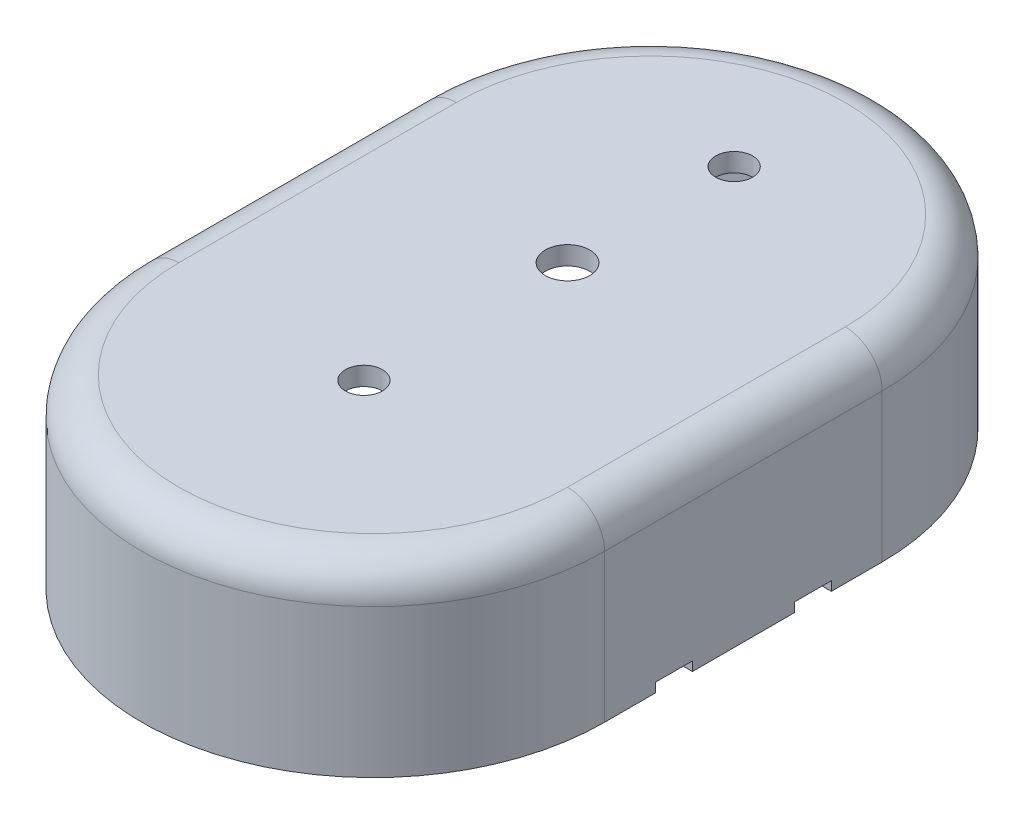
ISO-10303-21;
HEADER;
FILE_DESCRIPTION(('STEP AP214'),'2;1');
FILE_NAME('part.step','',(''),(''),'','','');
FILE_SCHEMA(('AUTOMOTIVE_DESIGN { 1 0 10303 214 1 1 1 1 }'));
ENDSEC;
DATA;
#1=APPLICATION_CONTEXT('core data for automotive mechanical design processes');
#2=APPLICATION_PROTOCOL_DEFINITION('international standard','automotive_design',2000,#1);
#3=PRODUCT_CONTEXT('',#1,'mechanical');
#4=PRODUCT('Part','Part','',(#3));
#5=PRODUCT_RELATED_PRODUCT_CATEGORY('part','',(#4));
#6=PRODUCT_DEFINITION_FORMATION('','',#4);
#7=PRODUCT_DEFINITION_CONTEXT('part definition',#1,'design');
#8=PRODUCT_DEFINITION('design','',#6,#7);
#9=PRODUCT_DEFINITION_SHAPE('','',#8);
#10=(LENGTH_UNIT() NAMED_UNIT(*) SI_UNIT(.MILLI.,.METRE.));
#11=(NAMED_UNIT(*) PLANE_ANGLE_UNIT() SI_UNIT($,.RADIAN.));
#12=(NAMED_UNIT(*) SI_UNIT($,.STERADIAN.) SOLID_ANGLE_UNIT());
#13=UNCERTAINTY_MEASURE_WITH_UNIT(LENGTH_MEASURE(1.E-05),#10,'distance_accuracy_value','');
#14=(GEOMETRIC_REPRESENTATION_CONTEXT(3) GLOBAL_UNCERTAINTY_ASSIGNED_CONTEXT((#13)) GLOBAL_UNIT_ASSIGNED_CONTEXT((#10,
#11,#12)) REPRESENTATION_CONTEXT('',''));
#15=CARTESIAN_POINT('',(0.,0.,0.));
#16=DIRECTION('',(0.,0.,1.));
#17=DIRECTION('',(1.,0.,0.));
#18=AXIS2_PLACEMENT_3D('',#15,#16,#17);
#19=CARTESIAN_POINT('',(0.,0.,-37.5));
#20=DIRECTION('',(0.,1.,0.));
#21=DIRECTION('',(0.,0.,1.));
#22=AXIS2_PLACEMENT_3D('',#19,#20,#21);
#23=PLANE('',#22);
#24=DIRECTION('',(0.,0.,1.));
#25=VECTOR('',#24,1.);
#26=CARTESIAN_POINT('',(60.,0.,37.5));
#27=LINE('',#26,#25);
#28=CARTESIAN_POINT('',(60.,0.,-13.75));
#29=VERTEX_POINT('',#28);
#30=CARTESIAN_POINT('',(60.,0.,13.75));
#31=VERTEX_POINT('',#30);
#32=EDGE_CURVE('E372',#29,#31,#27,.T.);
#33=ORIENTED_EDGE('',*,*,#32,.F.);
#34=DIRECTION('',(-1.,0.,0.));
#35=VECTOR('',#34,1.);
#36=CARTESIAN_POINT('',(62.5,0.,-13.75));
#37=LINE('',#36,#35);
#38=CARTESIAN_POINT('',(62.5,0.,-13.75));
#39=VERTEX_POINT('',#38);
#40=EDGE_CURVE('E284',#39,#29,#37,.T.);
#41=ORIENTED_EDGE('',*,*,#40,.F.);
#42=DIRECTION('',(0.,0.,-1.));
#43=VECTOR('',#42,1.);
#44=CARTESIAN_POINT('',(62.5,0.,37.5));
#45=LINE('',#44,#43);
#46=CARTESIAN_POINT('',(62.5,0.,13.75));
#47=VERTEX_POINT('',#46);
#48=EDGE_CURVE('E268',#47,#39,#45,.T.);
#49=ORIENTED_EDGE('',*,*,#48,.F.);
#50=DIRECTION('',(-1.,0.,0.));
#51=VECTOR('',#50,1.);
#52=CARTESIAN_POINT('',(62.5,0.,13.75));
#53=LINE('',#52,#51);
#54=EDGE_CURVE('E281',#47,#31,#53,.T.);
#55=ORIENTED_EDGE('',*,*,#54,.T.);
#56=EDGE_LOOP('',(#33,#41,#49,#55));
#57=FACE_BOUND('',#56,.T.);
#58=ADVANCED_FACE('F37',(#57),#23,.F.);
#59=DIRECTION('',(0.,0.,1.));
#60=VECTOR('',#59,1.);
#61=CARTESIAN_POINT('',(-62.5,0.,37.5));
#62=LINE('',#61,#60);
#63=CARTESIAN_POINT('',(-62.5,0.,-13.75));
#64=VERTEX_POINT('',#63);
#65=CARTESIAN_POINT('',(-62.5,0.,13.75));
#66=VERTEX_POINT('',#65);
#67=EDGE_CURVE('E441',#64,#66,#62,.T.);
#68=ORIENTED_EDGE('',*,*,#67,.F.);
#69=CARTESIAN_POINT('',(-60.,0.,-13.75));
#70=VERTEX_POINT('',#69);
#71=EDGE_CURVE('E287',#70,#64,#37,.T.);
#72=ORIENTED_EDGE('',*,*,#71,.F.);
#73=DIRECTION('',(0.,0.,-1.));
#74=VECTOR('',#73,1.);
#75=CARTESIAN_POINT('',(-60.,0.,37.5));
#76=LINE('',#75,#74);
#77=CARTESIAN_POINT('',(-60.,0.,13.75));
#78=VERTEX_POINT('',#77);
#79=EDGE_CURVE('E366',#78,#70,#76,.T.);
#80=ORIENTED_EDGE('',*,*,#79,.F.);
#81=EDGE_CURVE('E313',#78,#66,#53,.T.);
#82=ORIENTED_EDGE('',*,*,#81,.T.);
#83=EDGE_LOOP('',(#68,#72,#80,#82));
#84=FACE_BOUND('',#83,.T.);
#85=ADVANCED_FACE('F524',(#84),#23,.F.);
#86=CARTESIAN_POINT('',(62.5,0.,-23.75));
#87=VERTEX_POINT('',#86);
#88=CARTESIAN_POINT('',(62.5,0.,-37.5));
#89=VERTEX_POINT('',#88);
#90=EDGE_CURVE('E444',#87,#89,#45,.T.);
#91=ORIENTED_EDGE('',*,*,#90,.F.);
#92=DIRECTION('',(-1.,0.,0.));
#93=VECTOR('',#92,1.);
#94=CARTESIAN_POINT('',(62.5,0.,-23.75));
#95=LINE('',#94,#93);
#96=CARTESIAN_POINT('',(60.,0.,-23.75));
#97=VERTEX_POINT('',#96);
#98=EDGE_CURVE('E288',#87,#97,#95,.T.);
#99=ORIENTED_EDGE('',*,*,#98,.T.);
#100=CARTESIAN_POINT('',(60.,0.,-37.5));
#101=VERTEX_POINT('',#100);
#102=EDGE_CURVE('E347',#101,#97,#27,.T.);
#103=ORIENTED_EDGE('',*,*,#102,.F.);
#104=CARTESIAN_POINT('',(0.,0.,-37.5));
#105=DIRECTION('',(0.,-1.,0.));
#106=DIRECTION('',(0.,0.,-1.));
#107=AXIS2_PLACEMENT_3D('',#104,#105,#106);
#108=CIRCLE('',#107,60.);
#109=CARTESIAN_POINT('',(-60.,0.,-37.5));
#110=VERTEX_POINT('',#109);
#111=EDGE_CURVE('E365',#110,#101,#108,.T.);
#112=ORIENTED_EDGE('',*,*,#111,.F.);
#113=CARTESIAN_POINT('',(-60.,0.,-23.75));
#114=VERTEX_POINT('',#113);
#115=EDGE_CURVE('E361',#114,#110,#76,.T.);
#116=ORIENTED_EDGE('',*,*,#115,.F.);
#117=CARTESIAN_POINT('',(-62.5,0.,-23.75));
#118=VERTEX_POINT('',#117);
#119=EDGE_CURVE('E291',#114,#118,#95,.T.);
#120=ORIENTED_EDGE('',*,*,#119,.T.);
#121=CARTESIAN_POINT('',(-62.5,0.,-37.5));
#122=VERTEX_POINT('',#121);
#123=EDGE_CURVE('E437',#122,#118,#62,.T.);
#124=ORIENTED_EDGE('',*,*,#123,.F.);
#125=CARTESIAN_POINT('',(0.,0.,-37.5));
#126=DIRECTION('',(0.,1.,0.));
#127=DIRECTION('',(0.,0.,1.));
#128=AXIS2_PLACEMENT_3D('',#125,#126,#127);
#129=CIRCLE('',#128,62.5);
#130=EDGE_CURVE('E432',#89,#122,#129,.T.);
#131=ORIENTED_EDGE('',*,*,#130,.F.);
#132=EDGE_LOOP('',(#91,#99,#103,#112,#116,#120,#124,#131));
#133=FACE_BOUND('',#132,.T.);
#134=ADVANCED_FACE('F504',(#133),#23,.F.);
#135=CARTESIAN_POINT('',(60.,2.5,37.5));
#136=DIRECTION('',(1.,0.,0.));
#137=DIRECTION('',(0.,0.,-1.));
#138=AXIS2_PLACEMENT_3D('',#135,#136,#137);
#139=PLANE('',#138);
#140=DIRECTION('',(0.,0.,1.));
#141=VECTOR('',#140,1.);
#142=CARTESIAN_POINT('',(60.,2.5,37.5));
#143=LINE('',#142,#141);
#144=CARTESIAN_POINT('',(60.,2.5,-13.75));
#145=VERTEX_POINT('',#144);
#146=CARTESIAN_POINT('',(60.,2.5,13.75));
#147=VERTEX_POINT('',#146);
#148=EDGE_CURVE('E359',#145,#147,#143,.T.);
#149=ORIENTED_EDGE('',*,*,#148,.F.);
#150=DIRECTION('',(0.,-1.,0.));
#151=VECTOR('',#150,1.);
#152=CARTESIAN_POINT('',(60.,2.5,-13.75));
#153=LINE('',#152,#151);
#154=EDGE_CURVE('E249',#145,#29,#153,.T.);
#155=ORIENTED_EDGE('',*,*,#154,.T.);
#156=ORIENTED_EDGE('',*,*,#32,.T.);
#157=DIRECTION('',(0.,1.,0.));
#158=VECTOR('',#157,1.);
#159=CARTESIAN_POINT('',(60.,2.5,13.75));
#160=LINE('',#159,#158);
#161=EDGE_CURVE('E329',#31,#147,#160,.T.);
#162=ORIENTED_EDGE('',*,*,#161,.T.);
#163=EDGE_LOOP('',(#149,#155,#156,#162));
#164=FACE_BOUND('',#163,.T.);
#165=ADVANCED_FACE('F608',(#164),#139,.F.);
#166=ORIENTED_EDGE('',*,*,#102,.T.);
#167=DIRECTION('',(0.,1.,0.));
#168=VECTOR('',#167,1.);
#169=CARTESIAN_POINT('',(60.,2.5,-23.75));
#170=LINE('',#169,#168);
#171=CARTESIAN_POINT('',(60.,2.5,-23.75));
#172=VERTEX_POINT('',#171);
#173=EDGE_CURVE('E335',#97,#172,#170,.T.);
#174=ORIENTED_EDGE('',*,*,#173,.T.);
#175=CARTESIAN_POINT('',(60.,2.5,-37.5));
#176=VERTEX_POINT('',#175);
#177=EDGE_CURVE('E356',#176,#172,#143,.T.);
#178=ORIENTED_EDGE('',*,*,#177,.F.);
#179=DIRECTION('',(0.,-1.,0.));
#180=VECTOR('',#179,1.);
#181=CARTESIAN_POINT('',(60.,2.5,-37.5));
#182=LINE('',#181,#180);
#183=EDGE_CURVE('E377',#176,#101,#182,.T.);
#184=ORIENTED_EDGE('',*,*,#183,.T.);
#185=EDGE_LOOP('',(#166,#174,#178,#184));
#186=FACE_BOUND('',#185,.T.);
#187=ADVANCED_FACE('F609',(#186),#139,.F.);
#188=CARTESIAN_POINT('',(-60.,2.5,37.5));
#189=DIRECTION('',(-1.,0.,0.));
#190=DIRECTION('',(0.,0.,1.));
#191=AXIS2_PLACEMENT_3D('',#188,#189,#190);
#192=PLANE('',#191);
#193=ORIENTED_EDGE('',*,*,#79,.T.);
#194=DIRECTION('',(0.,1.,0.));
#195=VECTOR('',#194,1.);
#196=CARTESIAN_POINT('',(-60.,2.5,-13.75));
#197=LINE('',#196,#195);
#198=CARTESIAN_POINT('',(-60.,2.5,-13.75));
#199=VERTEX_POINT('',#198);
#200=EDGE_CURVE('E338',#70,#199,#197,.T.);
#201=ORIENTED_EDGE('',*,*,#200,.T.);
#202=DIRECTION('',(0.,0.,-1.));
#203=VECTOR('',#202,1.);
#204=CARTESIAN_POINT('',(-60.,2.5,37.5));
#205=LINE('',#204,#203);
#206=CARTESIAN_POINT('',(-60.,2.5,13.75));
#207=VERTEX_POINT('',#206);
#208=EDGE_CURVE('E352',#207,#199,#205,.T.);
#209=ORIENTED_EDGE('',*,*,#208,.F.);
#210=DIRECTION('',(0.,-1.,0.));
#211=VECTOR('',#210,1.);
#212=CARTESIAN_POINT('',(-60.,2.5,13.75));
#213=LINE('',#212,#211);
#214=EDGE_CURVE('E326',#207,#78,#213,.T.);
#215=ORIENTED_EDGE('',*,*,#214,.T.);
#216=EDGE_LOOP('',(#193,#201,#209,#215));
#217=FACE_BOUND('',#216,.T.);
#218=ADVANCED_FACE('F624',(#217),#192,.F.);
#219=CARTESIAN_POINT('',(-60.,2.5,-23.75));
#220=VERTEX_POINT('',#219);
#221=CARTESIAN_POINT('',(-60.,2.5,-37.5));
#222=VERTEX_POINT('',#221);
#223=EDGE_CURVE('E346',#220,#222,#205,.T.);
#224=ORIENTED_EDGE('',*,*,#223,.F.);
#225=DIRECTION('',(0.,-1.,0.));
#226=VECTOR('',#225,1.);
#227=CARTESIAN_POINT('',(-60.,2.5,-23.75));
#228=LINE('',#227,#226);
#229=EDGE_CURVE('E332',#220,#114,#228,.T.);
#230=ORIENTED_EDGE('',*,*,#229,.T.);
#231=ORIENTED_EDGE('',*,*,#115,.T.);
#232=DIRECTION('',(0.,-1.,0.));
#233=VECTOR('',#232,1.);
#234=CARTESIAN_POINT('',(-60.,2.5,-37.5));
#235=LINE('',#234,#233);
#236=EDGE_CURVE('E379',#222,#110,#235,.T.);
#237=ORIENTED_EDGE('',*,*,#236,.F.);
#238=EDGE_LOOP('',(#224,#230,#231,#237));
#239=FACE_BOUND('',#238,.T.);
#240=ADVANCED_FACE('F574',(#239),#192,.F.);
#241=CARTESIAN_POINT('',(0.,50.,-37.5));
#242=DIRECTION('',(0.,-1.,0.));
#243=DIRECTION('',(0.,0.,-1.));
#244=AXIS2_PLACEMENT_3D('',#241,#242,#243);
#245=CYLINDRICAL_SURFACE('',#244,62.5);
#246=DIRECTION('',(0.,-1.,0.));
#247=VECTOR('',#246,1.);
#248=CARTESIAN_POINT('',(-62.5,50.,-37.5));
#249=LINE('',#248,#247);
#250=CARTESIAN_POINT('',(-62.5,40.,-37.5));
#251=VERTEX_POINT('',#250);
#252=EDGE_CURVE('E456',#251,#122,#249,.T.);
#253=ORIENTED_EDGE('',*,*,#252,.F.);
#254=CARTESIAN_POINT('',(0.,40.,-37.5));
#255=DIRECTION('',(0.,1.,0.));
#256=DIRECTION('',(0.,0.,1.));
#257=AXIS2_PLACEMENT_3D('',#254,#255,#256);
#258=CIRCLE('',#257,62.5);
#259=CARTESIAN_POINT('',(62.5,40.,-37.5));
#260=VERTEX_POINT('',#259);
#261=EDGE_CURVE('E45',#251,#260,#258,.F.);
#262=ORIENTED_EDGE('',*,*,#261,.T.);
#263=DIRECTION('',(0.,-1.,0.));
#264=VECTOR('',#263,1.);
#265=CARTESIAN_POINT('',(62.5,50.,-37.5));
#266=LINE('',#265,#264);
#267=EDGE_CURVE('E448',#260,#89,#266,.T.);
#268=ORIENTED_EDGE('',*,*,#267,.T.);
#269=ORIENTED_EDGE('',*,*,#130,.T.);
#270=EDGE_LOOP('',(#253,#262,#268,#269));
#271=FACE_BOUND('',#270,.T.);
#272=ADVANCED_FACE('F499',(#271),#245,.T.);
#273=CARTESIAN_POINT('',(-62.5,50.,37.5));
#274=DIRECTION('',(1.,0.,0.));
#275=DIRECTION('',(0.,0.,-1.));
#276=AXIS2_PLACEMENT_3D('',#273,#274,#275);
#277=PLANE('',#276);
#278=DIRECTION('',(0.,0.,-1.));
#279=VECTOR('',#278,1.);
#280=CARTESIAN_POINT('',(-62.5,2.5,-23.75));
#281=LINE('',#280,#279);
#282=CARTESIAN_POINT('',(-62.5,2.5,-13.75));
#283=VERTEX_POINT('',#282);
#284=CARTESIAN_POINT('',(-62.5,2.5,-23.75));
#285=VERTEX_POINT('',#284);
#286=EDGE_CURVE('E271',#283,#285,#281,.T.);
#287=ORIENTED_EDGE('',*,*,#286,.F.);
#288=DIRECTION('',(0.,1.,0.));
#289=VECTOR('',#288,1.);
#290=CARTESIAN_POINT('',(-62.5,0.,-13.75));
#291=LINE('',#290,#289);
#292=EDGE_CURVE('E278',#64,#283,#291,.T.);
#293=ORIENTED_EDGE('',*,*,#292,.F.);
#294=ORIENTED_EDGE('',*,*,#67,.T.);
#295=DIRECTION('',(0.,-1.,0.));
#296=VECTOR('',#295,1.);
#297=CARTESIAN_POINT('',(-62.5,0.,13.75));
#298=LINE('',#297,#296);
#299=CARTESIAN_POINT('',(-62.5,2.5,13.75));
#300=VERTEX_POINT('',#299);
#301=EDGE_CURVE('E297',#300,#66,#298,.T.);
#302=ORIENTED_EDGE('',*,*,#301,.F.);
#303=DIRECTION('',(0.,0.,-1.));
#304=VECTOR('',#303,1.);
#305=CARTESIAN_POINT('',(-62.5,2.5,23.75));
#306=LINE('',#305,#304);
#307=CARTESIAN_POINT('',(-62.5,2.5,23.75));
#308=VERTEX_POINT('',#307);
#309=EDGE_CURVE('E306',#308,#300,#306,.T.);
#310=ORIENTED_EDGE('',*,*,#309,.F.);
#311=DIRECTION('',(0.,1.,0.));
#312=VECTOR('',#311,1.);
#313=CARTESIAN_POINT('',(-62.5,0.,23.75));
#314=LINE('',#313,#312);
#315=CARTESIAN_POINT('',(-62.5,0.,23.75));
#316=VERTEX_POINT('',#315);
#317=EDGE_CURVE('E303',#316,#308,#314,.T.);
#318=ORIENTED_EDGE('',*,*,#317,.F.);
#319=CARTESIAN_POINT('',(-62.5,0.,37.5));
#320=VERTEX_POINT('',#319);
#321=EDGE_CURVE('E435',#316,#320,#62,.T.);
#322=ORIENTED_EDGE('',*,*,#321,.T.);
#323=DIRECTION('',(0.,-1.,0.));
#324=VECTOR('',#323,1.);
#325=CARTESIAN_POINT('',(-62.5,50.,37.5));
#326=LINE('',#325,#324);
#327=CARTESIAN_POINT('',(-62.5,40.,37.5));
#328=VERTEX_POINT('',#327);
#329=EDGE_CURVE('E453',#328,#320,#326,.T.);
#330=ORIENTED_EDGE('',*,*,#329,.F.);
#331=DIRECTION('',(0.,0.,1.));
#332=VECTOR('',#331,1.);
#333=CARTESIAN_POINT('',(-62.5,40.,-37.5));
#334=LINE('',#333,#332);
#335=EDGE_CURVE('E472',#328,#251,#334,.F.);
#336=ORIENTED_EDGE('',*,*,#335,.T.);
#337=ORIENTED_EDGE('',*,*,#252,.T.);
#338=ORIENTED_EDGE('',*,*,#123,.T.);
#339=DIRECTION('',(0.,-1.,0.));
#340=VECTOR('',#339,1.);
#341=CARTESIAN_POINT('',(-62.5,0.,-23.75));
#342=LINE('',#341,#340);
#343=EDGE_CURVE('E269',#285,#118,#342,.T.);
#344=ORIENTED_EDGE('',*,*,#343,.F.);
#345=EDGE_LOOP('',(#287,#293,#294,#302,#310,#318,#322,#330,#336,#337,#338,#344));
#346=FACE_BOUND('',#345,.T.);
#347=ADVANCED_FACE('F496',(#346),#277,.F.);
#348=CARTESIAN_POINT('',(0.,50.,37.5));
#349=DIRECTION('',(0.,-1.,0.));
#350=DIRECTION('',(0.,0.,-1.));
#351=AXIS2_PLACEMENT_3D('',#348,#349,#350);
#352=CYLINDRICAL_SURFACE('',#351,62.5);
#353=DIRECTION('',(0.,-1.,0.));
#354=VECTOR('',#353,1.);
#355=CARTESIAN_POINT('',(62.5,50.,37.5));
#356=LINE('',#355,#354);
#357=CARTESIAN_POINT('',(62.5,40.,37.5));
#358=VERTEX_POINT('',#357);
#359=CARTESIAN_POINT('',(62.5,0.,37.5));
#360=VERTEX_POINT('',#359);
#361=EDGE_CURVE('E451',#358,#360,#356,.T.);
#362=ORIENTED_EDGE('',*,*,#361,.F.);
#363=CARTESIAN_POINT('',(0.,40.,37.5));
#364=DIRECTION('',(0.,1.,0.));
#365=DIRECTION('',(0.,0.,1.));
#366=AXIS2_PLACEMENT_3D('',#363,#364,#365);
#367=CIRCLE('',#366,62.5);
#368=EDGE_CURVE('E470',#358,#328,#367,.F.);
#369=ORIENTED_EDGE('',*,*,#368,.T.);
#370=ORIENTED_EDGE('',*,*,#329,.T.);
#371=CARTESIAN_POINT('',(0.,0.,37.5));
#372=DIRECTION('',(0.,1.,0.));
#373=DIRECTION('',(0.,0.,-1.));
#374=AXIS2_PLACEMENT_3D('',#371,#372,#373);
#375=CIRCLE('',#374,62.5);
#376=EDGE_CURVE('E440',#320,#360,#375,.T.);
#377=ORIENTED_EDGE('',*,*,#376,.T.);
#378=EDGE_LOOP('',(#362,#369,#370,#377));
#379=FACE_BOUND('',#378,.T.);
#380=ADVANCED_FACE('F535',(#379),#352,.T.);
#381=CARTESIAN_POINT('',(62.5,50.,37.5));
#382=DIRECTION('',(-1.,0.,0.));
#383=DIRECTION('',(0.,0.,1.));
#384=AXIS2_PLACEMENT_3D('',#381,#382,#383);
#385=PLANE('',#384);
#386=ORIENTED_EDGE('',*,*,#48,.T.);
#387=DIRECTION('',(0.,1.,0.));
#388=VECTOR('',#387,1.);
#389=CARTESIAN_POINT('',(62.5,0.,-13.75));
#390=LINE('',#389,#388);
#391=CARTESIAN_POINT('',(62.5,2.5,-13.75));
#392=VERTEX_POINT('',#391);
#393=EDGE_CURVE('E246',#39,#392,#390,.T.);
#394=ORIENTED_EDGE('',*,*,#393,.T.);
#395=DIRECTION('',(0.,0.,-1.));
#396=VECTOR('',#395,1.);
#397=CARTESIAN_POINT('',(62.5,2.5,-23.75));
#398=LINE('',#397,#396);
#399=CARTESIAN_POINT('',(62.5,2.5,-23.75));
#400=VERTEX_POINT('',#399);
#401=EDGE_CURVE('E255',#392,#400,#398,.T.);
#402=ORIENTED_EDGE('',*,*,#401,.T.);
#403=DIRECTION('',(0.,-1.,0.));
#404=VECTOR('',#403,1.);
#405=CARTESIAN_POINT('',(62.5,0.,-23.75));
#406=LINE('',#405,#404);
#407=EDGE_CURVE('E262',#400,#87,#406,.T.);
#408=ORIENTED_EDGE('',*,*,#407,.T.);
#409=ORIENTED_EDGE('',*,*,#90,.T.);
#410=ORIENTED_EDGE('',*,*,#267,.F.);
#411=DIRECTION('',(0.,0.,-1.));
#412=VECTOR('',#411,1.);
#413=CARTESIAN_POINT('',(62.5,40.,37.5));
#414=LINE('',#413,#412);
#415=EDGE_CURVE('E467',#260,#358,#414,.F.);
#416=ORIENTED_EDGE('',*,*,#415,.T.);
#417=ORIENTED_EDGE('',*,*,#361,.T.);
#418=CARTESIAN_POINT('',(62.5,0.,23.75));
#419=VERTEX_POINT('',#418);
#420=EDGE_CURVE('E445',#360,#419,#45,.T.);
#421=ORIENTED_EDGE('',*,*,#420,.T.);
#422=DIRECTION('',(0.,1.,0.));
#423=VECTOR('',#422,1.);
#424=CARTESIAN_POINT('',(62.5,0.,23.75));
#425=LINE('',#424,#423);
#426=CARTESIAN_POINT('',(62.5,2.5,23.75));
#427=VERTEX_POINT('',#426);
#428=EDGE_CURVE('E293',#419,#427,#425,.T.);
#429=ORIENTED_EDGE('',*,*,#428,.T.);
#430=DIRECTION('',(0.,0.,-1.));
#431=VECTOR('',#430,1.);
#432=CARTESIAN_POINT('',(62.5,2.5,23.75));
#433=LINE('',#432,#431);
#434=CARTESIAN_POINT('',(62.5,2.5,13.75));
#435=VERTEX_POINT('',#434);
#436=EDGE_CURVE('E296',#427,#435,#433,.T.);
#437=ORIENTED_EDGE('',*,*,#436,.T.);
#438=DIRECTION('',(0.,-1.,0.));
#439=VECTOR('',#438,1.);
#440=CARTESIAN_POINT('',(62.5,0.,13.75));
#441=LINE('',#440,#439);
#442=EDGE_CURVE('E300',#435,#47,#441,.T.);
#443=ORIENTED_EDGE('',*,*,#442,.T.);
#444=EDGE_LOOP('',(#386,#394,#402,#408,#409,#410,#416,#417,#421,#429,#437,#443));
#445=FACE_BOUND('',#444,.T.);
#446=ADVANCED_FACE('F265',(#445),#385,.F.);
#447=CARTESIAN_POINT('',(0.,50.,-37.5));
#448=DIRECTION('',(0.,1.,0.));
#449=DIRECTION('',(0.,0.,1.));
#450=AXIS2_PLACEMENT_3D('',#447,#448,#449);
#451=PLANE('',#450);
#452=CARTESIAN_POINT('',(0.,50.,-60.));
#453=DIRECTION('',(0.,1.,0.));
#454=DIRECTION('',(0.,0.,1.));
#455=AXIS2_PLACEMENT_3D('',#452,#453,#454);
#456=CIRCLE('',#455,5.);
#457=CARTESIAN_POINT('',(0.,50.,-55.));
#458=VERTEX_POINT('',#457);
#459=EDGE_CURVE('E968',#458,#458,#456,.T.);
#460=ORIENTED_EDGE('',*,*,#459,.F.);
#461=EDGE_LOOP('',(#460));
#462=FACE_BOUND('',#461,.T.);
#463=CARTESIAN_POINT('',(0.,50.,-15.));
#464=DIRECTION('',(0.,1.,0.));
#465=DIRECTION('',(0.,0.,1.));
#466=AXIS2_PLACEMENT_3D('',#463,#464,#465);
#467=CIRCLE('',#466,6.);
#468=CARTESIAN_POINT('',(0.,50.,-8.99999999999997));
#469=VERTEX_POINT('',#468);
#470=EDGE_CURVE('E975',#469,#469,#467,.T.);
#471=ORIENTED_EDGE('',*,*,#470,.F.);
#472=EDGE_LOOP('',(#471));
#473=FACE_BOUND('',#472,.T.);
#474=CARTESIAN_POINT('',(0.,50.,40.));
#475=DIRECTION('',(0.,1.,0.));
#476=DIRECTION('',(0.,0.,1.));
#477=AXIS2_PLACEMENT_3D('',#474,#475,#476);
#478=CIRCLE('',#477,5.);
#479=CARTESIAN_POINT('',(0.,50.,45.));
#480=VERTEX_POINT('',#479);
#481=EDGE_CURVE('E979',#480,#480,#478,.T.);
#482=ORIENTED_EDGE('',*,*,#481,.F.);
#483=EDGE_LOOP('',(#482));
#484=FACE_BOUND('',#483,.T.);
#485=CARTESIAN_POINT('',(0.,50.,37.5));
#486=DIRECTION('',(0.,1.,0.));
#487=DIRECTION('',(0.,0.,1.));
#488=AXIS2_PLACEMENT_3D('',#485,#486,#487);
#489=CIRCLE('',#488,52.5);
#490=CARTESIAN_POINT('',(-52.5,50.,37.5));
#491=VERTEX_POINT('',#490);
#492=CARTESIAN_POINT('',(52.5,50.,37.5));
#493=VERTEX_POINT('',#492);
#494=EDGE_CURVE('E462',#491,#493,#489,.T.);
#495=ORIENTED_EDGE('',*,*,#494,.T.);
#496=DIRECTION('',(0.,0.,-1.));
#497=VECTOR('',#496,1.);
#498=CARTESIAN_POINT('',(52.5,50.,-37.5));
#499=LINE('',#498,#497);
#500=CARTESIAN_POINT('',(52.5,50.,-37.5));
#501=VERTEX_POINT('',#500);
#502=EDGE_CURVE('E464',#493,#501,#499,.T.);
#503=ORIENTED_EDGE('',*,*,#502,.T.);
#504=CARTESIAN_POINT('',(0.,50.,-37.5));
#505=DIRECTION('',(0.,1.,0.));
#506=DIRECTION('',(0.,0.,1.));
#507=AXIS2_PLACEMENT_3D('',#504,#505,#506);
#508=CIRCLE('',#507,52.5);
#509=CARTESIAN_POINT('',(-52.5,50.,-37.5));
#510=VERTEX_POINT('',#509);
#511=EDGE_CURVE('E458',#501,#510,#508,.T.);
#512=ORIENTED_EDGE('',*,*,#511,.T.);
#513=DIRECTION('',(0.,0.,1.));
#514=VECTOR('',#513,1.);
#515=CARTESIAN_POINT('',(-52.5,50.,37.5));
#516=LINE('',#515,#514);
#517=EDGE_CURVE('E460',#510,#491,#516,.T.);
#518=ORIENTED_EDGE('',*,*,#517,.T.);
#519=EDGE_LOOP('',(#495,#503,#512,#518));
#520=FACE_BOUND('',#519,.T.);
#521=ADVANCED_FACE('F548',(#462,#473,#484,#520),#451,.T.);
#522=ORIENTED_EDGE('',*,*,#321,.F.);
#523=DIRECTION('',(-1.,0.,0.));
#524=VECTOR('',#523,1.);
#525=CARTESIAN_POINT('',(62.5,0.,23.75));
#526=LINE('',#525,#524);
#527=CARTESIAN_POINT('',(-60.,0.,23.75));
#528=VERTEX_POINT('',#527);
#529=EDGE_CURVE('E302',#528,#316,#526,.T.);
#530=ORIENTED_EDGE('',*,*,#529,.F.);
#531=CARTESIAN_POINT('',(-60.,0.,37.5));
#532=VERTEX_POINT('',#531);
#533=EDGE_CURVE('E362',#532,#528,#76,.T.);
#534=ORIENTED_EDGE('',*,*,#533,.F.);
#535=CARTESIAN_POINT('',(0.,0.,37.5));
#536=DIRECTION('',(0.,-1.,0.));
#537=DIRECTION('',(0.,0.,-1.));
#538=AXIS2_PLACEMENT_3D('',#535,#536,#537);
#539=CIRCLE('',#538,60.);
#540=CARTESIAN_POINT('',(60.,0.,37.5));
#541=VERTEX_POINT('',#540);
#542=EDGE_CURVE('E342',#541,#532,#539,.T.);
#543=ORIENTED_EDGE('',*,*,#542,.F.);
#544=CARTESIAN_POINT('',(60.,0.,23.75));
#545=VERTEX_POINT('',#544);
#546=EDGE_CURVE('E369',#545,#541,#27,.T.);
#547=ORIENTED_EDGE('',*,*,#546,.F.);
#548=EDGE_CURVE('E52',#419,#545,#526,.T.);
#549=ORIENTED_EDGE('',*,*,#548,.F.);
#550=ORIENTED_EDGE('',*,*,#420,.F.);
#551=ORIENTED_EDGE('',*,*,#376,.F.);
#552=EDGE_LOOP('',(#522,#530,#534,#543,#547,#549,#550,#551));
#553=FACE_BOUND('',#552,.T.);
#554=ADVANCED_FACE('F537',(#553),#23,.F.);
#555=CARTESIAN_POINT('',(-52.5,40.,-37.5));
#556=DIRECTION('',(0.,0.,-1.));
#557=DIRECTION('',(-1.,0.,0.));
#558=AXIS2_PLACEMENT_3D('',#555,#556,#557);
#559=CYLINDRICAL_SURFACE('',#558,10.);
#560=CARTESIAN_POINT('',(-52.5,40.,-37.5));
#561=DIRECTION('',(0.,0.,-1.));
#562=DIRECTION('',(-1.,0.,0.));
#563=AXIS2_PLACEMENT_3D('',#560,#561,#562);
#564=CIRCLE('',#563,10.);
#565=EDGE_CURVE('E478',#251,#510,#564,.T.);
#566=ORIENTED_EDGE('',*,*,#565,.F.);
#567=ORIENTED_EDGE('',*,*,#335,.F.);
#568=CARTESIAN_POINT('',(-52.5,40.,37.5));
#569=DIRECTION('',(0.,0.,1.));
#570=DIRECTION('',(1.,0.,0.));
#571=AXIS2_PLACEMENT_3D('',#568,#569,#570);
#572=CIRCLE('',#571,10.);
#573=EDGE_CURVE('E436',#491,#328,#572,.T.);
#574=ORIENTED_EDGE('',*,*,#573,.F.);
#575=ORIENTED_EDGE('',*,*,#517,.F.);
#576=EDGE_LOOP('',(#566,#567,#574,#575));
#577=FACE_BOUND('',#576,.T.);
#578=ADVANCED_FACE('F39',(#577),#559,.T.);
#579=CARTESIAN_POINT('',(0.,40.,37.5));
#580=DIRECTION('',(0.,1.,0.));
#581=DIRECTION('',(0.,0.,1.));
#582=AXIS2_PLACEMENT_3D('',#579,#580,#581);
#583=TOROIDAL_SURFACE('',#582,52.5,10.);
#584=ORIENTED_EDGE('',*,*,#573,.T.);
#585=ORIENTED_EDGE('',*,*,#368,.F.);
#586=CARTESIAN_POINT('',(52.5,40.,37.5));
#587=DIRECTION('',(0.,0.,-1.));
#588=DIRECTION('',(-1.,0.,0.));
#589=AXIS2_PLACEMENT_3D('',#586,#587,#588);
#590=CIRCLE('',#589,10.);
#591=EDGE_CURVE('E476',#493,#358,#590,.T.);
#592=ORIENTED_EDGE('',*,*,#591,.F.);
#593=ORIENTED_EDGE('',*,*,#494,.F.);
#594=EDGE_LOOP('',(#584,#585,#592,#593));
#595=FACE_BOUND('',#594,.T.);
#596=ADVANCED_FACE('F485',(#595),#583,.T.);
#597=CARTESIAN_POINT('',(0.,40.,-37.5));
#598=DIRECTION('',(0.,1.,0.));
#599=DIRECTION('',(0.,0.,1.));
#600=AXIS2_PLACEMENT_3D('',#597,#598,#599);
#601=TOROIDAL_SURFACE('',#600,52.5,10.);
#602=ORIENTED_EDGE('',*,*,#565,.T.);
#603=ORIENTED_EDGE('',*,*,#511,.F.);
#604=CARTESIAN_POINT('',(52.5,40.,-37.5));
#605=DIRECTION('',(0.,0.,1.));
#606=DIRECTION('',(1.,0.,0.));
#607=AXIS2_PLACEMENT_3D('',#604,#605,#606);
#608=CIRCLE('',#607,10.);
#609=EDGE_CURVE('E399',#260,#501,#608,.T.);
#610=ORIENTED_EDGE('',*,*,#609,.F.);
#611=ORIENTED_EDGE('',*,*,#261,.F.);
#612=EDGE_LOOP('',(#602,#603,#610,#611));
#613=FACE_BOUND('',#612,.T.);
#614=ADVANCED_FACE('F546',(#613),#601,.T.);
#615=CARTESIAN_POINT('',(52.5,40.,-37.5));
#616=DIRECTION('',(0.,0.,1.));
#617=DIRECTION('',(1.,0.,0.));
#618=AXIS2_PLACEMENT_3D('',#615,#616,#617);
#619=CYLINDRICAL_SURFACE('',#618,10.);
#620=ORIENTED_EDGE('',*,*,#591,.T.);
#621=ORIENTED_EDGE('',*,*,#415,.F.);
#622=ORIENTED_EDGE('',*,*,#609,.T.);
#623=ORIENTED_EDGE('',*,*,#502,.F.);
#624=EDGE_LOOP('',(#620,#621,#622,#623));
#625=FACE_BOUND('',#624,.T.);
#626=ADVANCED_FACE('F542',(#625),#619,.T.);
#627=CARTESIAN_POINT('',(0.,2.5,37.5));
#628=DIRECTION('',(0.,-1.,0.));
#629=DIRECTION('',(0.,0.,-1.));
#630=AXIS2_PLACEMENT_3D('',#627,#628,#629);
#631=CYLINDRICAL_SURFACE('',#630,60.);
#632=ORIENTED_EDGE('',*,*,#542,.T.);
#633=DIRECTION('',(0.,-1.,0.));
#634=VECTOR('',#633,1.);
#635=CARTESIAN_POINT('',(-60.,2.5,37.5));
#636=LINE('',#635,#634);
#637=CARTESIAN_POINT('',(-60.,2.5,37.5));
#638=VERTEX_POINT('',#637);
#639=EDGE_CURVE('E358',#638,#532,#636,.T.);
#640=ORIENTED_EDGE('',*,*,#639,.F.);
#641=CARTESIAN_POINT('',(0.,2.5,37.5));
#642=DIRECTION('',(0.,-1.,0.));
#643=DIRECTION('',(0.,0.,-1.));
#644=AXIS2_PLACEMENT_3D('',#641,#642,#643);
#645=CIRCLE('',#644,60.);
#646=CARTESIAN_POINT('',(60.,2.5,37.5));
#647=VERTEX_POINT('',#646);
#648=EDGE_CURVE('E343',#647,#638,#645,.T.);
#649=ORIENTED_EDGE('',*,*,#648,.F.);
#650=DIRECTION('',(0.,-1.,0.));
#651=VECTOR('',#650,1.);
#652=CARTESIAN_POINT('',(60.,2.5,37.5));
#653=LINE('',#652,#651);
#654=EDGE_CURVE('E373',#647,#541,#653,.T.);
#655=ORIENTED_EDGE('',*,*,#654,.T.);
#656=EDGE_LOOP('',(#632,#640,#649,#655));
#657=FACE_BOUND('',#656,.T.);
#658=ADVANCED_FACE('F577',(#657),#631,.F.);
#659=CARTESIAN_POINT('',(60.,2.5,23.75));
#660=VERTEX_POINT('',#659);
#661=EDGE_CURVE('E355',#660,#647,#143,.T.);
#662=ORIENTED_EDGE('',*,*,#661,.F.);
#663=DIRECTION('',(0.,-1.,0.));
#664=VECTOR('',#663,1.);
#665=CARTESIAN_POINT('',(60.,2.5,23.75));
#666=LINE('',#665,#664);
#667=EDGE_CURVE('E324',#660,#545,#666,.T.);
#668=ORIENTED_EDGE('',*,*,#667,.T.);
#669=ORIENTED_EDGE('',*,*,#546,.T.);
#670=ORIENTED_EDGE('',*,*,#654,.F.);
#671=EDGE_LOOP('',(#662,#668,#669,#670));
#672=FACE_BOUND('',#671,.T.);
#673=ADVANCED_FACE('F600',(#672),#139,.F.);
#674=CARTESIAN_POINT('',(0.,2.5,-37.5));
#675=DIRECTION('',(0.,-1.,0.));
#676=DIRECTION('',(0.,0.,-1.));
#677=AXIS2_PLACEMENT_3D('',#674,#675,#676);
#678=CYLINDRICAL_SURFACE('',#677,60.);
#679=ORIENTED_EDGE('',*,*,#111,.T.);
#680=ORIENTED_EDGE('',*,*,#183,.F.);
#681=CARTESIAN_POINT('',(0.,2.5,-37.5));
#682=DIRECTION('',(0.,-1.,0.));
#683=DIRECTION('',(0.,0.,-1.));
#684=AXIS2_PLACEMENT_3D('',#681,#682,#683);
#685=CIRCLE('',#684,60.);
#686=EDGE_CURVE('E351',#222,#176,#685,.T.);
#687=ORIENTED_EDGE('',*,*,#686,.F.);
#688=ORIENTED_EDGE('',*,*,#236,.T.);
#689=EDGE_LOOP('',(#679,#680,#687,#688));
#690=FACE_BOUND('',#689,.T.);
#691=ADVANCED_FACE('F605',(#690),#678,.F.);
#692=ORIENTED_EDGE('',*,*,#533,.T.);
#693=DIRECTION('',(0.,1.,0.));
#694=VECTOR('',#693,1.);
#695=CARTESIAN_POINT('',(-60.,2.5,23.75));
#696=LINE('',#695,#694);
#697=CARTESIAN_POINT('',(-60.,2.5,23.75));
#698=VERTEX_POINT('',#697);
#699=EDGE_CURVE('E286',#528,#698,#696,.T.);
#700=ORIENTED_EDGE('',*,*,#699,.T.);
#701=EDGE_CURVE('E348',#638,#698,#205,.T.);
#702=ORIENTED_EDGE('',*,*,#701,.F.);
#703=ORIENTED_EDGE('',*,*,#639,.T.);
#704=EDGE_LOOP('',(#692,#700,#702,#703));
#705=FACE_BOUND('',#704,.T.);
#706=ADVANCED_FACE('F617',(#705),#192,.F.);
#707=CARTESIAN_POINT('',(0.,2.5,37.5));
#708=DIRECTION('',(0.,-1.,0.));
#709=DIRECTION('',(0.,0.,-1.));
#710=AXIS2_PLACEMENT_3D('',#707,#708,#709);
#711=PLANE('',#710);
#712=CARTESIAN_POINT('',(0.,2.5,37.5));
#713=DIRECTION('',(0.,-1.,0.));
#714=DIRECTION('',(0.,0.,-1.));
#715=AXIS2_PLACEMENT_3D('',#712,#713,#714);
#716=CIRCLE('',#715,57.5);
#717=CARTESIAN_POINT('',(57.5,2.5,37.5));
#718=VERTEX_POINT('',#717);
#719=CARTESIAN_POINT('',(-57.5,2.5,37.5));
#720=VERTEX_POINT('',#719);
#721=EDGE_CURVE('E376',#718,#720,#716,.T.);
#722=ORIENTED_EDGE('',*,*,#721,.F.);
#723=DIRECTION('',(0.,0.,1.));
#724=VECTOR('',#723,1.);
#725=CARTESIAN_POINT('',(57.5,2.5,37.5));
#726=LINE('',#725,#724);
#727=CARTESIAN_POINT('',(57.5,2.5,-37.5));
#728=VERTEX_POINT('',#727);
#729=EDGE_CURVE('E11',#728,#718,#726,.T.);
#730=ORIENTED_EDGE('',*,*,#729,.F.);
#731=CARTESIAN_POINT('',(0.,2.5,-37.5));
#732=DIRECTION('',(0.,-1.,0.));
#733=DIRECTION('',(0.,0.,-1.));
#734=AXIS2_PLACEMENT_3D('',#731,#732,#733);
#735=CIRCLE('',#734,57.5);
#736=CARTESIAN_POINT('',(-57.5,2.5,-37.5));
#737=VERTEX_POINT('',#736);
#738=EDGE_CURVE('E388',#737,#728,#735,.T.);
#739=ORIENTED_EDGE('',*,*,#738,.F.);
#740=DIRECTION('',(0.,0.,-1.));
#741=VECTOR('',#740,1.);
#742=CARTESIAN_POINT('',(-57.5,2.5,37.5));
#743=LINE('',#742,#741);
#744=EDGE_CURVE('E386',#720,#737,#743,.T.);
#745=ORIENTED_EDGE('',*,*,#744,.F.);
#746=EDGE_LOOP('',(#722,#730,#739,#745));
#747=FACE_BOUND('',#746,.T.);
#748=ORIENTED_EDGE('',*,*,#177,.T.);
#749=DIRECTION('',(-1.,0.,0.));
#750=VECTOR('',#749,1.);
#751=CARTESIAN_POINT('',(62.5,2.5,-23.75));
#752=LINE('',#751,#750);
#753=EDGE_CURVE('E258',#400,#172,#752,.T.);
#754=ORIENTED_EDGE('',*,*,#753,.F.);
#755=ORIENTED_EDGE('',*,*,#401,.F.);
#756=DIRECTION('',(-1.,0.,0.));
#757=VECTOR('',#756,1.);
#758=CARTESIAN_POINT('',(62.5,2.5,-13.75));
#759=LINE('',#758,#757);
#760=EDGE_CURVE('E60',#392,#145,#759,.T.);
#761=ORIENTED_EDGE('',*,*,#760,.T.);
#762=ORIENTED_EDGE('',*,*,#148,.T.);
#763=DIRECTION('',(-1.,0.,0.));
#764=VECTOR('',#763,1.);
#765=CARTESIAN_POINT('',(62.5,2.5,13.75));
#766=LINE('',#765,#764);
#767=EDGE_CURVE('E314',#435,#147,#766,.T.);
#768=ORIENTED_EDGE('',*,*,#767,.F.);
#769=ORIENTED_EDGE('',*,*,#436,.F.);
#770=DIRECTION('',(-1.,0.,0.));
#771=VECTOR('',#770,1.);
#772=CARTESIAN_POINT('',(62.5,2.5,23.75));
#773=LINE('',#772,#771);
#774=EDGE_CURVE('E317',#427,#660,#773,.T.);
#775=ORIENTED_EDGE('',*,*,#774,.T.);
#776=ORIENTED_EDGE('',*,*,#661,.T.);
#777=ORIENTED_EDGE('',*,*,#648,.T.);
#778=ORIENTED_EDGE('',*,*,#701,.T.);
#779=EDGE_CURVE('E320',#698,#308,#773,.T.);
#780=ORIENTED_EDGE('',*,*,#779,.T.);
#781=ORIENTED_EDGE('',*,*,#309,.T.);
#782=EDGE_CURVE('E316',#207,#300,#766,.T.);
#783=ORIENTED_EDGE('',*,*,#782,.F.);
#784=ORIENTED_EDGE('',*,*,#208,.T.);
#785=EDGE_CURVE('E252',#199,#283,#759,.T.);
#786=ORIENTED_EDGE('',*,*,#785,.T.);
#787=ORIENTED_EDGE('',*,*,#286,.T.);
#788=EDGE_CURVE('E251',#220,#285,#752,.T.);
#789=ORIENTED_EDGE('',*,*,#788,.F.);
#790=ORIENTED_EDGE('',*,*,#223,.T.);
#791=ORIENTED_EDGE('',*,*,#686,.T.);
#792=EDGE_LOOP('',(#748,#754,#755,#761,#762,#768,#769,#775,#776,#777,#778,#780,#781,#783,#784,
#786,#787,#789,#790,#791));
#793=FACE_BOUND('',#792,.T.);
#794=ADVANCED_FACE('F257',(#747,#793),#711,.T.);
#795=CARTESIAN_POINT('',(0.,45.,-37.5));
#796=DIRECTION('',(0.,1.,0.));
#797=DIRECTION('',(0.,0.,1.));
#798=AXIS2_PLACEMENT_3D('',#795,#796,#797);
#799=PLANE('',#798);
#800=CARTESIAN_POINT('',(0.,45.,-60.));
#801=DIRECTION('',(0.,1.,0.));
#802=DIRECTION('',(0.,0.,1.));
#803=AXIS2_PLACEMENT_3D('',#800,#801,#802);
#804=CIRCLE('',#803,5.);
#805=CARTESIAN_POINT('',(0.,45.,-55.));
#806=VERTEX_POINT('',#805);
#807=EDGE_CURVE('E307',#806,#806,#804,.F.);
#808=ORIENTED_EDGE('',*,*,#807,.F.);
#809=EDGE_LOOP('',(#808));
#810=FACE_BOUND('',#809,.T.);
#811=CARTESIAN_POINT('',(0.,45.,-15.));
#812=DIRECTION('',(0.,1.,0.));
#813=DIRECTION('',(0.,0.,1.));
#814=AXIS2_PLACEMENT_3D('',#811,#812,#813);
#815=CIRCLE('',#814,6.);
#816=CARTESIAN_POINT('',(0.,45.,-8.99999999999997));
#817=VERTEX_POINT('',#816);
#818=EDGE_CURVE('E972',#817,#817,#815,.F.);
#819=ORIENTED_EDGE('',*,*,#818,.F.);
#820=EDGE_LOOP('',(#819));
#821=FACE_BOUND('',#820,.T.);
#822=CARTESIAN_POINT('',(0.,45.,40.));
#823=DIRECTION('',(0.,1.,0.));
#824=DIRECTION('',(0.,0.,1.));
#825=AXIS2_PLACEMENT_3D('',#822,#823,#824);
#826=CIRCLE('',#825,5.);
#827=CARTESIAN_POINT('',(0.,45.,45.));
#828=VERTEX_POINT('',#827);
#829=EDGE_CURVE('E274',#828,#828,#826,.F.);
#830=ORIENTED_EDGE('',*,*,#829,.F.);
#831=EDGE_LOOP('',(#830));
#832=FACE_BOUND('',#831,.T.);
#833=CARTESIAN_POINT('',(0.,45.,37.5));
#834=DIRECTION('',(0.,1.,0.));
#835=DIRECTION('',(0.,0.,1.));
#836=AXIS2_PLACEMENT_3D('',#833,#834,#835);
#837=CIRCLE('',#836,52.5);
#838=CARTESIAN_POINT('',(-52.5,45.,37.5));
#839=VERTEX_POINT('',#838);
#840=CARTESIAN_POINT('',(52.5,45.,37.5));
#841=VERTEX_POINT('',#840);
#842=EDGE_CURVE('E422',#839,#841,#837,.T.);
#843=ORIENTED_EDGE('',*,*,#842,.F.);
#844=DIRECTION('',(0.,0.,1.));
#845=VECTOR('',#844,1.);
#846=CARTESIAN_POINT('',(-52.5,45.,-37.5));
#847=LINE('',#846,#845);
#848=CARTESIAN_POINT('',(-52.5,45.,-37.5));
#849=VERTEX_POINT('',#848);
#850=EDGE_CURVE('E424',#849,#839,#847,.T.);
#851=ORIENTED_EDGE('',*,*,#850,.F.);
#852=CARTESIAN_POINT('',(0.,45.,-37.5));
#853=DIRECTION('',(0.,1.,0.));
#854=DIRECTION('',(0.,0.,1.));
#855=AXIS2_PLACEMENT_3D('',#852,#853,#854);
#856=CIRCLE('',#855,52.5);
#857=CARTESIAN_POINT('',(52.5,45.,-37.5));
#858=VERTEX_POINT('',#857);
#859=EDGE_CURVE('E395',#858,#849,#856,.T.);
#860=ORIENTED_EDGE('',*,*,#859,.F.);
#861=DIRECTION('',(0.,0.,1.));
#862=VECTOR('',#861,1.);
#863=CARTESIAN_POINT('',(52.5,45.,-37.5));
#864=LINE('',#863,#862);
#865=EDGE_CURVE('E416',#841,#858,#864,.F.);
#866=ORIENTED_EDGE('',*,*,#865,.F.);
#867=EDGE_LOOP('',(#843,#851,#860,#866));
#868=FACE_BOUND('',#867,.T.);
#869=ADVANCED_FACE('F633',(#810,#821,#832,#868),#799,.F.);
#870=CARTESIAN_POINT('',(0.,40.,-37.5));
#871=DIRECTION('',(0.,1.,0.));
#872=DIRECTION('',(0.,0.,1.));
#873=AXIS2_PLACEMENT_3D('',#870,#871,#872);
#874=TOROIDAL_SURFACE('',#873,52.5,5.);
#875=CARTESIAN_POINT('',(-52.5,40.,-37.5));
#876=DIRECTION('',(0.,0.,-1.));
#877=DIRECTION('',(-1.,0.,0.));
#878=AXIS2_PLACEMENT_3D('',#875,#876,#877);
#879=CIRCLE('',#878,5.);
#880=CARTESIAN_POINT('',(-57.5,40.,-37.5));
#881=VERTEX_POINT('',#880);
#882=EDGE_CURVE('E419',#881,#849,#879,.T.);
#883=ORIENTED_EDGE('',*,*,#882,.F.);
#884=CARTESIAN_POINT('',(0.,40.,-37.5));
#885=DIRECTION('',(0.,-1.,0.));
#886=DIRECTION('',(0.,0.,-1.));
#887=AXIS2_PLACEMENT_3D('',#884,#885,#886);
#888=CIRCLE('',#887,57.5);
#889=CARTESIAN_POINT('',(57.5,40.,-37.5));
#890=VERTEX_POINT('',#889);
#891=EDGE_CURVE('E397',#881,#890,#888,.T.);
#892=ORIENTED_EDGE('',*,*,#891,.T.);
#893=CARTESIAN_POINT('',(52.5,40.,-37.5));
#894=DIRECTION('',(0.,0.,1.));
#895=DIRECTION('',(1.,0.,0.));
#896=AXIS2_PLACEMENT_3D('',#893,#894,#895);
#897=CIRCLE('',#896,5.);
#898=EDGE_CURVE('E391',#890,#858,#897,.T.);
#899=ORIENTED_EDGE('',*,*,#898,.T.);
#900=ORIENTED_EDGE('',*,*,#859,.T.);
#901=EDGE_LOOP('',(#883,#892,#899,#900));
#902=FACE_BOUND('',#901,.T.);
#903=ADVANCED_FACE('F748',(#902),#874,.F.);
#904=CARTESIAN_POINT('',(-52.5,40.,-37.5));
#905=DIRECTION('',(0.,0.,-1.));
#906=DIRECTION('',(-1.,0.,0.));
#907=AXIS2_PLACEMENT_3D('',#904,#905,#906);
#908=CYLINDRICAL_SURFACE('',#907,5.);
#909=ORIENTED_EDGE('',*,*,#882,.T.);
#910=ORIENTED_EDGE('',*,*,#850,.T.);
#911=CARTESIAN_POINT('',(-52.5,40.,37.5));
#912=DIRECTION('',(0.,0.,-1.));
#913=DIRECTION('',(-1.,0.,0.));
#914=AXIS2_PLACEMENT_3D('',#911,#912,#913);
#915=CIRCLE('',#914,5.);
#916=CARTESIAN_POINT('',(-57.5,40.,37.5));
#917=VERTEX_POINT('',#916);
#918=EDGE_CURVE('E405',#839,#917,#915,.F.);
#919=ORIENTED_EDGE('',*,*,#918,.T.);
#920=DIRECTION('',(0.,0.,-1.));
#921=VECTOR('',#920,1.);
#922=CARTESIAN_POINT('',(-57.5,40.,37.5));
#923=LINE('',#922,#921);
#924=EDGE_CURVE('E400',#917,#881,#923,.T.);
#925=ORIENTED_EDGE('',*,*,#924,.T.);
#926=EDGE_LOOP('',(#909,#910,#919,#925));
#927=FACE_BOUND('',#926,.T.);
#928=ADVANCED_FACE('F794',(#927),#908,.F.);
#929=CARTESIAN_POINT('',(0.,40.,37.5));
#930=DIRECTION('',(0.,1.,0.));
#931=DIRECTION('',(0.,0.,1.));
#932=AXIS2_PLACEMENT_3D('',#929,#930,#931);
#933=TOROIDAL_SURFACE('',#932,52.5,5.);
#934=ORIENTED_EDGE('',*,*,#918,.F.);
#935=ORIENTED_EDGE('',*,*,#842,.T.);
#936=CARTESIAN_POINT('',(52.5,40.,37.5));
#937=DIRECTION('',(0.,0.,1.));
#938=DIRECTION('',(1.,0.,0.));
#939=AXIS2_PLACEMENT_3D('',#936,#937,#938);
#940=CIRCLE('',#939,5.);
#941=CARTESIAN_POINT('',(57.5,40.,37.5));
#942=VERTEX_POINT('',#941);
#943=EDGE_CURVE('E420',#841,#942,#940,.F.);
#944=ORIENTED_EDGE('',*,*,#943,.T.);
#945=CARTESIAN_POINT('',(0.,40.,37.5));
#946=DIRECTION('',(0.,-1.,0.));
#947=DIRECTION('',(0.,0.,-1.));
#948=AXIS2_PLACEMENT_3D('',#945,#946,#947);
#949=CIRCLE('',#948,57.5);
#950=EDGE_CURVE('E409',#942,#917,#949,.T.);
#951=ORIENTED_EDGE('',*,*,#950,.T.);
#952=EDGE_LOOP('',(#934,#935,#944,#951));
#953=FACE_BOUND('',#952,.T.);
#954=ADVANCED_FACE('F797',(#953),#933,.F.);
#955=CARTESIAN_POINT('',(52.5,40.,-37.5));
#956=DIRECTION('',(0.,0.,1.));
#957=DIRECTION('',(1.,0.,0.));
#958=AXIS2_PLACEMENT_3D('',#955,#956,#957);
#959=CYLINDRICAL_SURFACE('',#958,5.);
#960=ORIENTED_EDGE('',*,*,#943,.F.);
#961=ORIENTED_EDGE('',*,*,#865,.T.);
#962=ORIENTED_EDGE('',*,*,#898,.F.);
#963=DIRECTION('',(0.,0.,1.));
#964=VECTOR('',#963,1.);
#965=CARTESIAN_POINT('',(57.5,40.,37.5));
#966=LINE('',#965,#964);
#967=EDGE_CURVE('E413',#890,#942,#966,.T.);
#968=ORIENTED_EDGE('',*,*,#967,.T.);
#969=EDGE_LOOP('',(#960,#961,#962,#968));
#970=FACE_BOUND('',#969,.T.);
#971=ADVANCED_FACE('F648',(#970),#959,.F.);
#972=CARTESIAN_POINT('',(57.5,50.,37.5));
#973=DIRECTION('',(-1.,0.,0.));
#974=DIRECTION('',(0.,0.,1.));
#975=AXIS2_PLACEMENT_3D('',#972,#973,#974);
#976=PLANE('',#975);
#977=DIRECTION('',(0.,-1.,0.));
#978=VECTOR('',#977,1.);
#979=CARTESIAN_POINT('',(57.5,50.,-37.5));
#980=LINE('',#979,#978);
#981=EDGE_CURVE('E401',#890,#728,#980,.T.);
#982=ORIENTED_EDGE('',*,*,#981,.T.);
#983=ORIENTED_EDGE('',*,*,#729,.T.);
#984=DIRECTION('',(0.,1.,0.));
#985=VECTOR('',#984,1.);
#986=CARTESIAN_POINT('',(57.5,50.,37.5));
#987=LINE('',#986,#985);
#988=EDGE_CURVE('E404',#942,#718,#987,.F.);
#989=ORIENTED_EDGE('',*,*,#988,.F.);
#990=ORIENTED_EDGE('',*,*,#967,.F.);
#991=EDGE_LOOP('',(#982,#983,#989,#990));
#992=FACE_BOUND('',#991,.T.);
#993=ADVANCED_FACE('F642',(#992),#976,.T.);
#994=CARTESIAN_POINT('',(0.,50.,37.5));
#995=DIRECTION('',(0.,-1.,0.));
#996=DIRECTION('',(0.,0.,-1.));
#997=AXIS2_PLACEMENT_3D('',#994,#995,#996);
#998=CYLINDRICAL_SURFACE('',#997,57.5);
#999=ORIENTED_EDGE('',*,*,#988,.T.);
#1000=ORIENTED_EDGE('',*,*,#721,.T.);
#1001=DIRECTION('',(0.,-1.,0.));
#1002=VECTOR('',#1001,1.);
#1003=CARTESIAN_POINT('',(-57.5,50.,37.5));
#1004=LINE('',#1003,#1002);
#1005=EDGE_CURVE('E396',#917,#720,#1004,.T.);
#1006=ORIENTED_EDGE('',*,*,#1005,.F.);
#1007=ORIENTED_EDGE('',*,*,#950,.F.);
#1008=EDGE_LOOP('',(#999,#1000,#1006,#1007));
#1009=FACE_BOUND('',#1008,.T.);
#1010=ADVANCED_FACE('F647',(#1009),#998,.F.);
#1011=CARTESIAN_POINT('',(-57.5,50.,37.5));
#1012=DIRECTION('',(1.,0.,0.));
#1013=DIRECTION('',(0.,0.,-1.));
#1014=AXIS2_PLACEMENT_3D('',#1011,#1012,#1013);
#1015=PLANE('',#1014);
#1016=ORIENTED_EDGE('',*,*,#1005,.T.);
#1017=ORIENTED_EDGE('',*,*,#744,.T.);
#1018=DIRECTION('',(0.,1.,0.));
#1019=VECTOR('',#1018,1.);
#1020=CARTESIAN_POINT('',(-57.5,50.,-37.5));
#1021=LINE('',#1020,#1019);
#1022=EDGE_CURVE('E392',#881,#737,#1021,.F.);
#1023=ORIENTED_EDGE('',*,*,#1022,.F.);
#1024=ORIENTED_EDGE('',*,*,#924,.F.);
#1025=EDGE_LOOP('',(#1016,#1017,#1023,#1024));
#1026=FACE_BOUND('',#1025,.T.);
#1027=ADVANCED_FACE('F658',(#1026),#1015,.T.);
#1028=CARTESIAN_POINT('',(0.,50.,-37.5));
#1029=DIRECTION('',(0.,-1.,0.));
#1030=DIRECTION('',(0.,0.,-1.));
#1031=AXIS2_PLACEMENT_3D('',#1028,#1029,#1030);
#1032=CYLINDRICAL_SURFACE('',#1031,57.5);
#1033=ORIENTED_EDGE('',*,*,#1022,.T.);
#1034=ORIENTED_EDGE('',*,*,#738,.T.);
#1035=ORIENTED_EDGE('',*,*,#981,.F.);
#1036=ORIENTED_EDGE('',*,*,#891,.F.);
#1037=EDGE_LOOP('',(#1033,#1034,#1035,#1036));
#1038=FACE_BOUND('',#1037,.T.);
#1039=ADVANCED_FACE('F663',(#1038),#1032,.F.);
#1040=CARTESIAN_POINT('',(62.5,0.,23.75));
#1041=DIRECTION('',(0.,0.,1.));
#1042=DIRECTION('',(1.,0.,0.));
#1043=AXIS2_PLACEMENT_3D('',#1040,#1041,#1042);
#1044=PLANE('',#1043);
#1045=ORIENTED_EDGE('',*,*,#529,.T.);
#1046=ORIENTED_EDGE('',*,*,#317,.T.);
#1047=ORIENTED_EDGE('',*,*,#779,.F.);
#1048=ORIENTED_EDGE('',*,*,#699,.F.);
#1049=EDGE_LOOP('',(#1045,#1046,#1047,#1048));
#1050=FACE_BOUND('',#1049,.T.);
#1051=ADVANCED_FACE('F671',(#1050),#1044,.F.);
#1052=CARTESIAN_POINT('',(62.5,0.,13.75));
#1053=DIRECTION('',(0.,0.,-1.));
#1054=DIRECTION('',(-1.,0.,0.));
#1055=AXIS2_PLACEMENT_3D('',#1052,#1053,#1054);
#1056=PLANE('',#1055);
#1057=ORIENTED_EDGE('',*,*,#782,.T.);
#1058=ORIENTED_EDGE('',*,*,#301,.T.);
#1059=ORIENTED_EDGE('',*,*,#81,.F.);
#1060=ORIENTED_EDGE('',*,*,#214,.F.);
#1061=EDGE_LOOP('',(#1057,#1058,#1059,#1060));
#1062=FACE_BOUND('',#1061,.T.);
#1063=ADVANCED_FACE('F675',(#1062),#1056,.F.);
#1064=CARTESIAN_POINT('',(62.5,0.,-23.75));
#1065=DIRECTION('',(0.,0.,-1.));
#1066=DIRECTION('',(-1.,0.,0.));
#1067=AXIS2_PLACEMENT_3D('',#1064,#1065,#1066);
#1068=PLANE('',#1067);
#1069=ORIENTED_EDGE('',*,*,#788,.T.);
#1070=ORIENTED_EDGE('',*,*,#343,.T.);
#1071=ORIENTED_EDGE('',*,*,#119,.F.);
#1072=ORIENTED_EDGE('',*,*,#229,.F.);
#1073=EDGE_LOOP('',(#1069,#1070,#1071,#1072));
#1074=FACE_BOUND('',#1073,.T.);
#1075=ADVANCED_FACE('F510',(#1074),#1068,.F.);
#1076=CARTESIAN_POINT('',(62.5,0.,-13.75));
#1077=DIRECTION('',(0.,0.,1.));
#1078=DIRECTION('',(1.,0.,0.));
#1079=AXIS2_PLACEMENT_3D('',#1076,#1077,#1078);
#1080=PLANE('',#1079);
#1081=ORIENTED_EDGE('',*,*,#71,.T.);
#1082=ORIENTED_EDGE('',*,*,#292,.T.);
#1083=ORIENTED_EDGE('',*,*,#785,.F.);
#1084=ORIENTED_EDGE('',*,*,#200,.F.);
#1085=EDGE_LOOP('',(#1081,#1082,#1083,#1084));
#1086=FACE_BOUND('',#1085,.T.);
#1087=ADVANCED_FACE('F517',(#1086),#1080,.F.);
#1088=ORIENTED_EDGE('',*,*,#54,.F.);
#1089=ORIENTED_EDGE('',*,*,#442,.F.);
#1090=ORIENTED_EDGE('',*,*,#767,.T.);
#1091=ORIENTED_EDGE('',*,*,#161,.F.);
#1092=EDGE_LOOP('',(#1088,#1089,#1090,#1091));
#1093=FACE_BOUND('',#1092,.T.);
#1094=ADVANCED_FACE('F688',(#1093),#1056,.F.);
#1095=ORIENTED_EDGE('',*,*,#774,.F.);
#1096=ORIENTED_EDGE('',*,*,#428,.F.);
#1097=ORIENTED_EDGE('',*,*,#548,.T.);
#1098=ORIENTED_EDGE('',*,*,#667,.F.);
#1099=EDGE_LOOP('',(#1095,#1096,#1097,#1098));
#1100=FACE_BOUND('',#1099,.T.);
#1101=ADVANCED_FACE('F678',(#1100),#1044,.F.);
#1102=ORIENTED_EDGE('',*,*,#760,.F.);
#1103=ORIENTED_EDGE('',*,*,#393,.F.);
#1104=ORIENTED_EDGE('',*,*,#40,.T.);
#1105=ORIENTED_EDGE('',*,*,#154,.F.);
#1106=EDGE_LOOP('',(#1102,#1103,#1104,#1105));
#1107=FACE_BOUND('',#1106,.T.);
#1108=ADVANCED_FACE('F244',(#1107),#1080,.F.);
#1109=ORIENTED_EDGE('',*,*,#98,.F.);
#1110=ORIENTED_EDGE('',*,*,#407,.F.);
#1111=ORIENTED_EDGE('',*,*,#753,.T.);
#1112=ORIENTED_EDGE('',*,*,#173,.F.);
#1113=EDGE_LOOP('',(#1109,#1110,#1111,#1112));
#1114=FACE_BOUND('',#1113,.T.);
#1115=ADVANCED_FACE('F697',(#1114),#1068,.F.);
#1116=CARTESIAN_POINT('',(0.,-0.001000000000001,40.));
#1117=DIRECTION('',(0.,1.,0.));
#1118=DIRECTION('',(0.,0.,1.));
#1119=AXIS2_PLACEMENT_3D('',#1116,#1117,#1118);
#1120=CYLINDRICAL_SURFACE('',#1119,5.);
#1121=ORIENTED_EDGE('',*,*,#481,.T.);
#1122=EDGE_LOOP('',(#1121));
#1123=FACE_BOUND('',#1122,.T.);
#1124=ORIENTED_EDGE('',*,*,#829,.T.);
#1125=EDGE_LOOP('',(#1124));
#1126=FACE_BOUND('',#1125,.T.);
#1127=ADVANCED_FACE('F734',(#1123,#1126),#1120,.F.);
#1128=CARTESIAN_POINT('',(0.,-0.001000000000001,-15.));
#1129=DIRECTION('',(0.,1.,0.));
#1130=DIRECTION('',(0.,0.,1.));
#1131=AXIS2_PLACEMENT_3D('',#1128,#1129,#1130);
#1132=CYLINDRICAL_SURFACE('',#1131,6.);
#1133=ORIENTED_EDGE('',*,*,#470,.T.);
#1134=EDGE_LOOP('',(#1133));
#1135=FACE_BOUND('',#1134,.T.);
#1136=ORIENTED_EDGE('',*,*,#818,.T.);
#1137=EDGE_LOOP('',(#1136));
#1138=FACE_BOUND('',#1137,.T.);
#1139=ADVANCED_FACE('F759',(#1135,#1138),#1132,.F.);
#1140=CARTESIAN_POINT('',(0.,-0.001000000000001,-60.));
#1141=DIRECTION('',(0.,1.,0.));
#1142=DIRECTION('',(0.,0.,1.));
#1143=AXIS2_PLACEMENT_3D('',#1140,#1141,#1142);
#1144=CYLINDRICAL_SURFACE('',#1143,5.);
#1145=ORIENTED_EDGE('',*,*,#459,.T.);
#1146=EDGE_LOOP('',(#1145));
#1147=FACE_BOUND('',#1146,.T.);
#1148=ORIENTED_EDGE('',*,*,#807,.T.);
#1149=EDGE_LOOP('',(#1148));
#1150=FACE_BOUND('',#1149,.T.);
#1151=ADVANCED_FACE('F769',(#1147,#1150),#1144,.F.);
#1152=CLOSED_SHELL('',(#58,#85,#134,#165,#187,#218,#240,#272,#347,#380,#446,#521,#554,#578,#596,
#614,#626,#658,#673,#691,#706,#794,#869,#903,#928,#954,#971,#993,#1010,#1027,#1039,#1051,#1063,
#1075,#1087,#1094,#1101,#1108,#1115,#1127,#1139,#1151));
#1153=MANIFOLD_SOLID_BREP('B2',#1152);
#1154=ADVANCED_BREP_SHAPE_REPRESENTATION('',(#18,#1153),#14);
#1155=SHAPE_DEFINITION_REPRESENTATION(#9,#1154);
ENDSEC;
END-ISO-10303-21;
